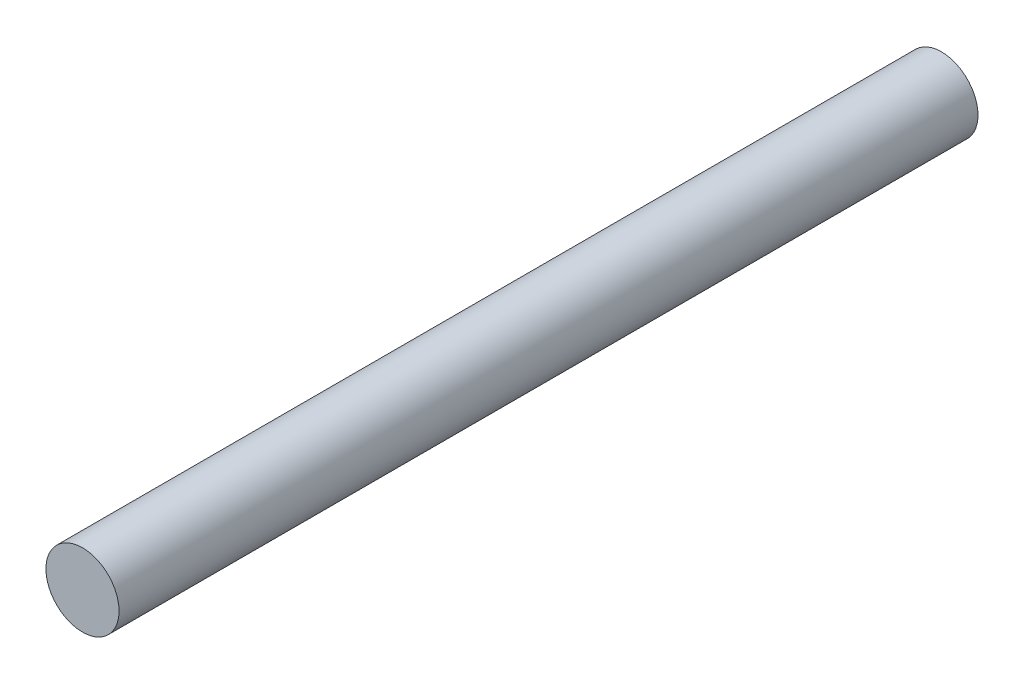
ISO-10303-21;
HEADER;
FILE_DESCRIPTION(('STEP AP214'),'2;1');
FILE_NAME('part.step','',(''),(''),'','','');
FILE_SCHEMA(('AUTOMOTIVE_DESIGN { 1 0 10303 214 1 1 1 1 }'));
ENDSEC;
DATA;
#1=APPLICATION_CONTEXT('core data for automotive mechanical design processes');
#2=APPLICATION_PROTOCOL_DEFINITION('international standard','automotive_design',2000,#1);
#3=PRODUCT_CONTEXT('',#1,'mechanical');
#4=PRODUCT('Part','Part','',(#3));
#5=PRODUCT_RELATED_PRODUCT_CATEGORY('part','',(#4));
#6=PRODUCT_DEFINITION_FORMATION('','',#4);
#7=PRODUCT_DEFINITION_CONTEXT('part definition',#1,'design');
#8=PRODUCT_DEFINITION('design','',#6,#7);
#9=PRODUCT_DEFINITION_SHAPE('','',#8);
#10=(LENGTH_UNIT() NAMED_UNIT(*) SI_UNIT(.MILLI.,.METRE.));
#11=(NAMED_UNIT(*) PLANE_ANGLE_UNIT() SI_UNIT($,.RADIAN.));
#12=(NAMED_UNIT(*) SI_UNIT($,.STERADIAN.) SOLID_ANGLE_UNIT());
#13=UNCERTAINTY_MEASURE_WITH_UNIT(LENGTH_MEASURE(1.E-05),#10,'distance_accuracy_value','');
#14=(GEOMETRIC_REPRESENTATION_CONTEXT(3) GLOBAL_UNCERTAINTY_ASSIGNED_CONTEXT((#13)) GLOBAL_UNIT_ASSIGNED_CONTEXT((#10,
#11,#12)) REPRESENTATION_CONTEXT('',''));
#15=CARTESIAN_POINT('',(0.,0.,0.));
#16=DIRECTION('',(0.,0.,1.));
#17=DIRECTION('',(1.,0.,0.));
#18=AXIS2_PLACEMENT_3D('',#15,#16,#17);
#19=CARTESIAN_POINT('',(0.,0.,37.30625));
#20=DIRECTION('',(0.,0.,-1.));
#21=DIRECTION('',(-1.,0.,0.));
#22=AXIS2_PLACEMENT_3D('',#19,#20,#21);
#23=CYLINDRICAL_SURFACE('',#22,1.5875);
#24=CARTESIAN_POINT('',(0.,0.,37.30625));
#25=DIRECTION('',(0.,0.,1.));
#26=DIRECTION('',(1.,0.,0.));
#27=AXIS2_PLACEMENT_3D('',#24,#25,#26);
#28=CIRCLE('',#27,1.5875);
#29=CARTESIAN_POINT('',(1.5875,0.,37.30625));
#30=VERTEX_POINT('',#29);
#31=EDGE_CURVE('E10',#30,#30,#28,.T.);
#32=ORIENTED_EDGE('',*,*,#31,.F.);
#33=EDGE_LOOP('',(#32));
#34=FACE_BOUND('',#33,.T.);
#35=CARTESIAN_POINT('',(0.,0.,0.));
#36=DIRECTION('',(0.,0.,1.));
#37=DIRECTION('',(1.,0.,0.));
#38=AXIS2_PLACEMENT_3D('',#35,#36,#37);
#39=CIRCLE('',#38,1.5875);
#40=CARTESIAN_POINT('',(1.5875,0.,0.));
#41=VERTEX_POINT('',#40);
#42=EDGE_CURVE('E46',#41,#41,#39,.T.);
#43=ORIENTED_EDGE('',*,*,#42,.T.);
#44=EDGE_LOOP('',(#43));
#45=FACE_BOUND('',#44,.T.);
#46=ADVANCED_FACE('F43',(#34,#45),#23,.T.);
#47=CARTESIAN_POINT('',(0.,0.,37.30625));
#48=DIRECTION('',(0.,0.,1.));
#49=DIRECTION('',(1.,0.,0.));
#50=AXIS2_PLACEMENT_3D('',#47,#48,#49);
#51=PLANE('',#50);
#52=ORIENTED_EDGE('',*,*,#31,.T.);
#53=EDGE_LOOP('',(#52));
#54=FACE_BOUND('',#53,.T.);
#55=ADVANCED_FACE('F60',(#54),#51,.T.);
#56=CARTESIAN_POINT('',(0.,0.,0.));
#57=DIRECTION('',(0.,0.,1.));
#58=DIRECTION('',(1.,0.,0.));
#59=AXIS2_PLACEMENT_3D('',#56,#57,#58);
#60=PLANE('',#59);
#61=ORIENTED_EDGE('',*,*,#42,.F.);
#62=EDGE_LOOP('',(#61));
#63=FACE_BOUND('',#62,.T.);
#64=ADVANCED_FACE('F58',(#63),#60,.F.);
#65=CLOSED_SHELL('',(#46,#55,#64));
#66=MANIFOLD_SOLID_BREP('B2',#65);
#67=ADVANCED_BREP_SHAPE_REPRESENTATION('',(#18,#66),#14);
#68=SHAPE_DEFINITION_REPRESENTATION(#9,#67);
ENDSEC;
END-ISO-10303-21;
